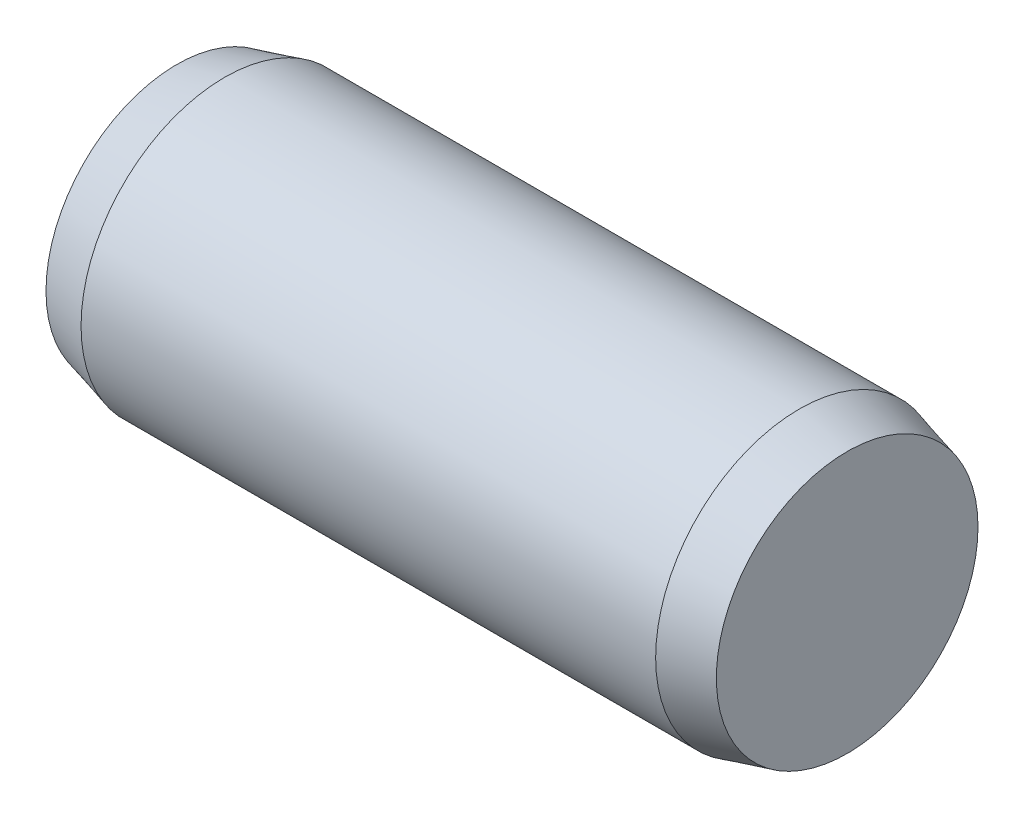
ISO-10303-21;
HEADER;
FILE_DESCRIPTION(('STEP AP214'),'2;1');
FILE_NAME('part.step','',(''),(''),'','','');
FILE_SCHEMA(('AUTOMOTIVE_DESIGN { 1 0 10303 214 1 1 1 1 }'));
ENDSEC;
DATA;
#1=APPLICATION_CONTEXT('core data for automotive mechanical design processes');
#2=APPLICATION_PROTOCOL_DEFINITION('international standard','automotive_design',2000,#1);
#3=PRODUCT_CONTEXT('',#1,'mechanical');
#4=PRODUCT('Part','Part','',(#3));
#5=PRODUCT_RELATED_PRODUCT_CATEGORY('part','',(#4));
#6=PRODUCT_DEFINITION_FORMATION('','',#4);
#7=PRODUCT_DEFINITION_CONTEXT('part definition',#1,'design');
#8=PRODUCT_DEFINITION('design','',#6,#7);
#9=PRODUCT_DEFINITION_SHAPE('','',#8);
#10=(LENGTH_UNIT() NAMED_UNIT(*) SI_UNIT(.MILLI.,.METRE.));
#11=(NAMED_UNIT(*) PLANE_ANGLE_UNIT() SI_UNIT($,.RADIAN.));
#12=(NAMED_UNIT(*) SI_UNIT($,.STERADIAN.) SOLID_ANGLE_UNIT());
#13=UNCERTAINTY_MEASURE_WITH_UNIT(LENGTH_MEASURE(1.E-05),#10,'distance_accuracy_value','');
#14=(GEOMETRIC_REPRESENTATION_CONTEXT(3) GLOBAL_UNCERTAINTY_ASSIGNED_CONTEXT((#13)) GLOBAL_UNIT_ASSIGNED_CONTEXT((#10,
#11,#12)) REPRESENTATION_CONTEXT('',''));
#15=CARTESIAN_POINT('',(0.,0.,0.));
#16=DIRECTION('',(0.,0.,1.));
#17=DIRECTION('',(1.,0.,0.));
#18=AXIS2_PLACEMENT_3D('',#15,#16,#17);
#19=CARTESIAN_POINT('',(-3.,0.,0.));
#20=DIRECTION('',(1.,0.,0.));
#21=DIRECTION('',(0.,0.,-1.));
#22=AXIS2_PLACEMENT_3D('',#19,#20,#21);
#23=CYLINDRICAL_SURFACE('',#22,1.5);
#24=CARTESIAN_POINT('',(-3.,0.,0.));
#25=DIRECTION('',(-1.,0.,0.));
#26=DIRECTION('',(0.,0.,1.));
#27=AXIS2_PLACEMENT_3D('',#24,#25,#26);
#28=CIRCLE('',#27,1.5);
#29=CARTESIAN_POINT('',(-3.,0.,1.5));
#30=VERTEX_POINT('',#29);
#31=EDGE_CURVE('E44',#30,#30,#28,.T.);
#32=ORIENTED_EDGE('',*,*,#31,.F.);
#33=EDGE_LOOP('',(#32));
#34=FACE_BOUND('',#33,.T.);
#35=CARTESIAN_POINT('',(3.,0.,0.));
#36=DIRECTION('',(1.,0.,0.));
#37=DIRECTION('',(0.,0.,-1.));
#38=AXIS2_PLACEMENT_3D('',#35,#36,#37);
#39=CIRCLE('',#38,1.5);
#40=CARTESIAN_POINT('',(3.,0.,-1.5));
#41=VERTEX_POINT('',#40);
#42=EDGE_CURVE('E10',#41,#41,#39,.T.);
#43=ORIENTED_EDGE('',*,*,#42,.F.);
#44=EDGE_LOOP('',(#43));
#45=FACE_BOUND('',#44,.T.);
#46=ADVANCED_FACE('F30',(#34,#45),#23,.T.);
#47=CARTESIAN_POINT('',(3.,0.,0.));
#48=DIRECTION('',(-1.,0.,0.));
#49=DIRECTION('',(0.,0.,-1.));
#50=AXIS2_PLACEMENT_3D('',#47,#48,#49);
#51=CONICAL_SURFACE('',#50,1.5,0.26179938779915);
#52=CARTESIAN_POINT('',(3.5,0.,0.));
#53=DIRECTION('',(1.,0.,0.));
#54=DIRECTION('',(0.,0.,-1.));
#55=AXIS2_PLACEMENT_3D('',#52,#53,#54);
#56=CIRCLE('',#55,1.36602540378444);
#57=CARTESIAN_POINT('',(3.5,0.,-1.36602540378444));
#58=VERTEX_POINT('',#57);
#59=EDGE_CURVE('E36',#58,#58,#56,.T.);
#60=ORIENTED_EDGE('',*,*,#59,.F.);
#61=EDGE_LOOP('',(#60));
#62=FACE_BOUND('',#61,.T.);
#63=ORIENTED_EDGE('',*,*,#42,.T.);
#64=EDGE_LOOP('',(#63));
#65=FACE_BOUND('',#64,.T.);
#66=ADVANCED_FACE('F54',(#62,#65),#51,.T.);
#67=CARTESIAN_POINT('',(3.5,0.,0.));
#68=DIRECTION('',(1.,0.,0.));
#69=DIRECTION('',(0.,0.,-1.));
#70=AXIS2_PLACEMENT_3D('',#67,#68,#69);
#71=PLANE('',#70);
#72=ORIENTED_EDGE('',*,*,#59,.T.);
#73=EDGE_LOOP('',(#72));
#74=FACE_BOUND('',#73,.T.);
#75=ADVANCED_FACE('F58',(#74),#71,.T.);
#76=CARTESIAN_POINT('',(-3.,0.,0.));
#77=DIRECTION('',(1.,0.,0.));
#78=DIRECTION('',(0.,0.,1.));
#79=AXIS2_PLACEMENT_3D('',#76,#77,#78);
#80=CONICAL_SURFACE('',#79,1.5,0.26179938779915);
#81=CARTESIAN_POINT('',(-3.5,0.,0.));
#82=DIRECTION('',(-1.,0.,0.));
#83=DIRECTION('',(0.,0.,1.));
#84=AXIS2_PLACEMENT_3D('',#81,#82,#83);
#85=CIRCLE('',#84,1.36602540378444);
#86=CARTESIAN_POINT('',(-3.5,0.,1.36602540378444));
#87=VERTEX_POINT('',#86);
#88=EDGE_CURVE('E40',#87,#87,#85,.T.);
#89=ORIENTED_EDGE('',*,*,#88,.F.);
#90=EDGE_LOOP('',(#89));
#91=FACE_BOUND('',#90,.T.);
#92=ORIENTED_EDGE('',*,*,#31,.T.);
#93=EDGE_LOOP('',(#92));
#94=FACE_BOUND('',#93,.T.);
#95=ADVANCED_FACE('F50',(#91,#94),#80,.T.);
#96=CARTESIAN_POINT('',(-3.5,0.,0.));
#97=DIRECTION('',(-1.,0.,0.));
#98=DIRECTION('',(0.,0.,1.));
#99=AXIS2_PLACEMENT_3D('',#96,#97,#98);
#100=PLANE('',#99);
#101=ORIENTED_EDGE('',*,*,#88,.T.);
#102=EDGE_LOOP('',(#101));
#103=FACE_BOUND('',#102,.T.);
#104=ADVANCED_FACE('F67',(#103),#100,.T.);
#105=CLOSED_SHELL('',(#46,#66,#75,#95,#104));
#106=MANIFOLD_SOLID_BREP('B2',#105);
#107=ADVANCED_BREP_SHAPE_REPRESENTATION('',(#18,#106),#14);
#108=SHAPE_DEFINITION_REPRESENTATION(#9,#107);
ENDSEC;
END-ISO-10303-21;
